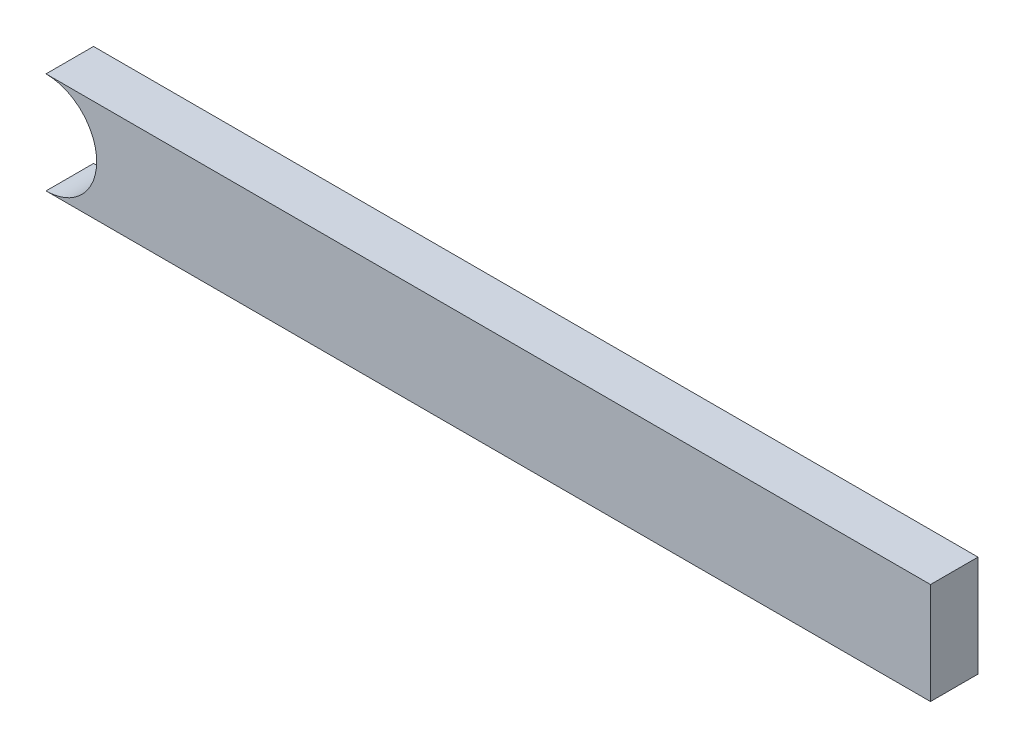
ISO-10303-21;
HEADER;
FILE_DESCRIPTION(('STEP AP214'),'2;1');
FILE_NAME('part.step','',(''),(''),'','','');
FILE_SCHEMA(('AUTOMOTIVE_DESIGN { 1 0 10303 214 1 1 1 1 }'));
ENDSEC;
DATA;
#1=APPLICATION_CONTEXT('core data for automotive mechanical design processes');
#2=APPLICATION_PROTOCOL_DEFINITION('international standard','automotive_design',2000,#1);
#3=PRODUCT_CONTEXT('',#1,'mechanical');
#4=PRODUCT('Part','Part','',(#3));
#5=PRODUCT_RELATED_PRODUCT_CATEGORY('part','',(#4));
#6=PRODUCT_DEFINITION_FORMATION('','',#4);
#7=PRODUCT_DEFINITION_CONTEXT('part definition',#1,'design');
#8=PRODUCT_DEFINITION('design','',#6,#7);
#9=PRODUCT_DEFINITION_SHAPE('','',#8);
#10=(LENGTH_UNIT() NAMED_UNIT(*) SI_UNIT(.MILLI.,.METRE.));
#11=(NAMED_UNIT(*) PLANE_ANGLE_UNIT() SI_UNIT($,.RADIAN.));
#12=(NAMED_UNIT(*) SI_UNIT($,.STERADIAN.) SOLID_ANGLE_UNIT());
#13=UNCERTAINTY_MEASURE_WITH_UNIT(LENGTH_MEASURE(1.E-05),#10,'distance_accuracy_value','');
#14=(GEOMETRIC_REPRESENTATION_CONTEXT(3) GLOBAL_UNCERTAINTY_ASSIGNED_CONTEXT((#13)) GLOBAL_UNIT_ASSIGNED_CONTEXT((#10,
#11,#12)) REPRESENTATION_CONTEXT('',''));
#15=CARTESIAN_POINT('',(0.,0.,0.));
#16=DIRECTION('',(0.,0.,1.));
#17=DIRECTION('',(1.,0.,0.));
#18=AXIS2_PLACEMENT_3D('',#15,#16,#17);
#19=CARTESIAN_POINT('',(-27.923916791617,0.,3.));
#20=DIRECTION('',(0.,0.,-1.));
#21=DIRECTION('',(-1.,0.,0.));
#22=AXIS2_PLACEMENT_3D('',#19,#20,#21);
#23=CYLINDRICAL_SURFACE('',#22,3.2);
#24=CARTESIAN_POINT('',(-27.923916791617,0.,0.));
#25=DIRECTION('',(0.,0.,-1.));
#26=DIRECTION('',(-1.,0.,0.));
#27=AXIS2_PLACEMENT_3D('',#24,#25,#26);
#28=CIRCLE('',#27,3.2);
#29=CARTESIAN_POINT('',(-27.923916791617,3.2,0.));
#30=VERTEX_POINT('',#29);
#31=CARTESIAN_POINT('',(-27.923916791617,-3.2,0.));
#32=VERTEX_POINT('',#31);
#33=EDGE_CURVE('E104',#30,#32,#28,.T.);
#34=ORIENTED_EDGE('',*,*,#33,.T.);
#35=DIRECTION('',(0.,0.,-1.));
#36=VECTOR('',#35,1.);
#37=CARTESIAN_POINT('',(-27.923916791617,-3.2,3.));
#38=LINE('',#37,#36);
#39=CARTESIAN_POINT('',(-27.923916791617,-3.2,3.));
#40=VERTEX_POINT('',#39);
#41=EDGE_CURVE('E11',#40,#32,#38,.T.);
#42=ORIENTED_EDGE('',*,*,#41,.F.);
#43=CARTESIAN_POINT('',(-27.923916791617,0.,3.));
#44=DIRECTION('',(0.,0.,-1.));
#45=DIRECTION('',(-1.,0.,0.));
#46=AXIS2_PLACEMENT_3D('',#43,#44,#45);
#47=CIRCLE('',#46,3.2);
#48=CARTESIAN_POINT('',(-27.923916791617,3.2,3.));
#49=VERTEX_POINT('',#48);
#50=EDGE_CURVE('E92',#49,#40,#47,.T.);
#51=ORIENTED_EDGE('',*,*,#50,.F.);
#52=DIRECTION('',(0.,0.,-1.));
#53=VECTOR('',#52,1.);
#54=CARTESIAN_POINT('',(-27.923916791617,3.2,3.));
#55=LINE('',#54,#53);
#56=EDGE_CURVE('E100',#49,#30,#55,.T.);
#57=ORIENTED_EDGE('',*,*,#56,.T.);
#58=EDGE_LOOP('',(#34,#42,#51,#57));
#59=FACE_BOUND('',#58,.T.);
#60=ADVANCED_FACE('F41',(#59),#23,.F.);
#61=CARTESIAN_POINT('',(27.923916791617,-3.2,3.));
#62=DIRECTION('',(0.,1.,0.));
#63=DIRECTION('',(0.,0.,1.));
#64=AXIS2_PLACEMENT_3D('',#61,#62,#63);
#65=PLANE('',#64);
#66=DIRECTION('',(1.,0.,0.));
#67=VECTOR('',#66,1.);
#68=CARTESIAN_POINT('',(27.923916791617,-3.2,0.));
#69=LINE('',#68,#67);
#70=CARTESIAN_POINT('',(27.923916791617,-3.2,0.));
#71=VERTEX_POINT('',#70);
#72=EDGE_CURVE('E96',#32,#71,#69,.T.);
#73=ORIENTED_EDGE('',*,*,#72,.T.);
#74=DIRECTION('',(0.,0.,-1.));
#75=VECTOR('',#74,1.);
#76=CARTESIAN_POINT('',(27.923916791617,-3.2,3.));
#77=LINE('',#76,#75);
#78=CARTESIAN_POINT('',(27.923916791617,-3.2,3.));
#79=VERTEX_POINT('',#78);
#80=EDGE_CURVE('E49',#79,#71,#77,.T.);
#81=ORIENTED_EDGE('',*,*,#80,.F.);
#82=DIRECTION('',(1.,0.,0.));
#83=VECTOR('',#82,1.);
#84=CARTESIAN_POINT('',(27.923916791617,-3.2,3.));
#85=LINE('',#84,#83);
#86=EDGE_CURVE('E87',#40,#79,#85,.T.);
#87=ORIENTED_EDGE('',*,*,#86,.F.);
#88=ORIENTED_EDGE('',*,*,#41,.T.);
#89=EDGE_LOOP('',(#73,#81,#87,#88));
#90=FACE_BOUND('',#89,.T.);
#91=ADVANCED_FACE('F95',(#90),#65,.F.);
#92=CARTESIAN_POINT('',(27.923916791617,-3.2,3.));
#93=DIRECTION('',(-1.,0.,0.));
#94=DIRECTION('',(0.,0.,1.));
#95=AXIS2_PLACEMENT_3D('',#92,#93,#94);
#96=PLANE('',#95);
#97=DIRECTION('',(0.,1.,0.));
#98=VECTOR('',#97,1.);
#99=CARTESIAN_POINT('',(27.923916791617,-3.2,0.));
#100=LINE('',#99,#98);
#101=CARTESIAN_POINT('',(27.923916791617,3.2,0.));
#102=VERTEX_POINT('',#101);
#103=EDGE_CURVE('E74',#71,#102,#100,.T.);
#104=ORIENTED_EDGE('',*,*,#103,.T.);
#105=DIRECTION('',(0.,0.,-1.));
#106=VECTOR('',#105,1.);
#107=CARTESIAN_POINT('',(27.923916791617,3.2,3.));
#108=LINE('',#107,#106);
#109=CARTESIAN_POINT('',(27.923916791617,3.2,3.));
#110=VERTEX_POINT('',#109);
#111=EDGE_CURVE('E97',#110,#102,#108,.T.);
#112=ORIENTED_EDGE('',*,*,#111,.F.);
#113=DIRECTION('',(0.,1.,0.));
#114=VECTOR('',#113,1.);
#115=CARTESIAN_POINT('',(27.923916791617,-3.2,3.));
#116=LINE('',#115,#114);
#117=EDGE_CURVE('E90',#79,#110,#116,.T.);
#118=ORIENTED_EDGE('',*,*,#117,.F.);
#119=ORIENTED_EDGE('',*,*,#80,.T.);
#120=EDGE_LOOP('',(#104,#112,#118,#119));
#121=FACE_BOUND('',#120,.T.);
#122=ADVANCED_FACE('F98',(#121),#96,.F.);
#123=CARTESIAN_POINT('',(27.923916791617,3.2,3.));
#124=DIRECTION('',(0.,-1.,0.));
#125=DIRECTION('',(0.,0.,-1.));
#126=AXIS2_PLACEMENT_3D('',#123,#124,#125);
#127=PLANE('',#126);
#128=DIRECTION('',(-1.,0.,0.));
#129=VECTOR('',#128,1.);
#130=CARTESIAN_POINT('',(27.923916791617,3.2,0.));
#131=LINE('',#130,#129);
#132=EDGE_CURVE('E80',#102,#30,#131,.T.);
#133=ORIENTED_EDGE('',*,*,#132,.T.);
#134=ORIENTED_EDGE('',*,*,#56,.F.);
#135=DIRECTION('',(-1.,0.,0.));
#136=VECTOR('',#135,1.);
#137=CARTESIAN_POINT('',(27.923916791617,3.2,3.));
#138=LINE('',#137,#136);
#139=EDGE_CURVE('E57',#110,#49,#138,.T.);
#140=ORIENTED_EDGE('',*,*,#139,.F.);
#141=ORIENTED_EDGE('',*,*,#111,.T.);
#142=EDGE_LOOP('',(#133,#134,#140,#141));
#143=FACE_BOUND('',#142,.T.);
#144=ADVANCED_FACE('F111',(#143),#127,.F.);
#145=CARTESIAN_POINT('',(-27.923916791617,0.,3.));
#146=DIRECTION('',(0.,0.,-1.));
#147=DIRECTION('',(-1.,0.,0.));
#148=AXIS2_PLACEMENT_3D('',#145,#146,#147);
#149=PLANE('',#148);
#150=ORIENTED_EDGE('',*,*,#50,.T.);
#151=ORIENTED_EDGE('',*,*,#86,.T.);
#152=ORIENTED_EDGE('',*,*,#117,.T.);
#153=ORIENTED_EDGE('',*,*,#139,.T.);
#154=EDGE_LOOP('',(#150,#151,#152,#153));
#155=FACE_BOUND('',#154,.T.);
#156=ADVANCED_FACE('F88',(#155),#149,.F.);
#157=CARTESIAN_POINT('',(-27.923916791617,0.,0.));
#158=DIRECTION('',(0.,0.,-1.));
#159=DIRECTION('',(-1.,0.,0.));
#160=AXIS2_PLACEMENT_3D('',#157,#158,#159);
#161=PLANE('',#160);
#162=ORIENTED_EDGE('',*,*,#33,.F.);
#163=ORIENTED_EDGE('',*,*,#132,.F.);
#164=ORIENTED_EDGE('',*,*,#103,.F.);
#165=ORIENTED_EDGE('',*,*,#72,.F.);
#166=EDGE_LOOP('',(#162,#163,#164,#165));
#167=FACE_BOUND('',#166,.T.);
#168=ADVANCED_FACE('F114',(#167),#161,.T.);
#169=CLOSED_SHELL('',(#60,#91,#122,#144,#156,#168));
#170=MANIFOLD_SOLID_BREP('B2',#169);
#171=ADVANCED_BREP_SHAPE_REPRESENTATION('',(#18,#170),#14);
#172=SHAPE_DEFINITION_REPRESENTATION(#9,#171);
ENDSEC;
END-ISO-10303-21;
